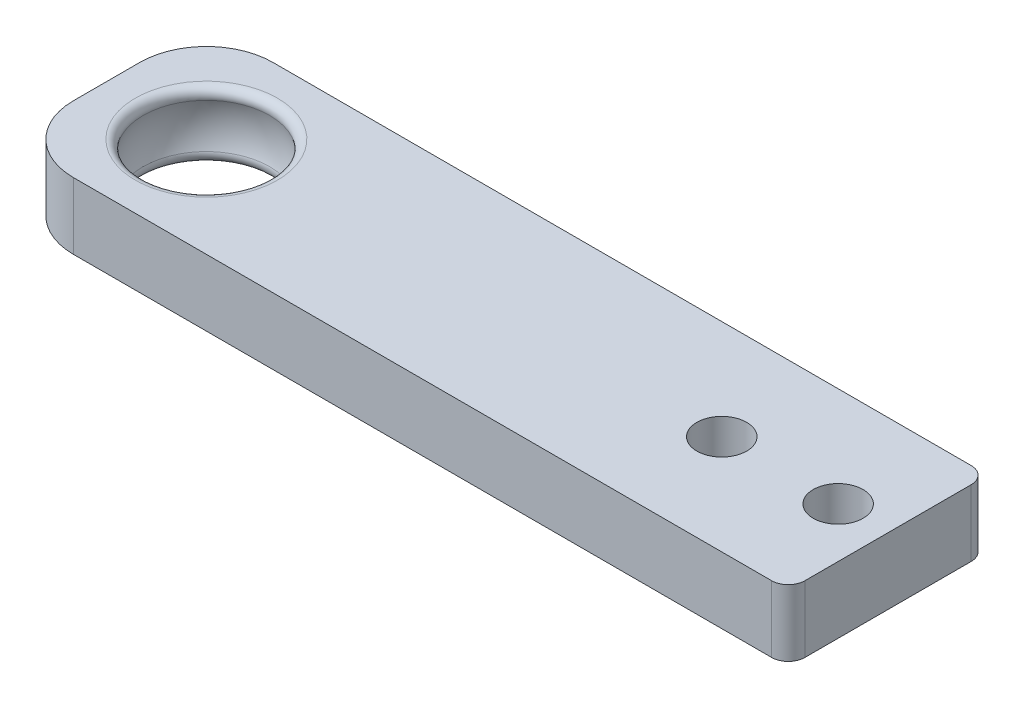
ISO-10303-21;
HEADER;
FILE_DESCRIPTION(('STEP AP214'),'2;1');
FILE_NAME('part.step','',(''),(''),'','','');
FILE_SCHEMA(('AUTOMOTIVE_DESIGN { 1 0 10303 214 1 1 1 1 }'));
ENDSEC;
DATA;
#1=APPLICATION_CONTEXT('core data for automotive mechanical design processes');
#2=APPLICATION_PROTOCOL_DEFINITION('international standard','automotive_design',2000,#1);
#3=PRODUCT_CONTEXT('',#1,'mechanical');
#4=PRODUCT('Part','Part','',(#3));
#5=PRODUCT_RELATED_PRODUCT_CATEGORY('part','',(#4));
#6=PRODUCT_DEFINITION_FORMATION('','',#4);
#7=PRODUCT_DEFINITION_CONTEXT('part definition',#1,'design');
#8=PRODUCT_DEFINITION('design','',#6,#7);
#9=PRODUCT_DEFINITION_SHAPE('','',#8);
#10=(LENGTH_UNIT() NAMED_UNIT(*) SI_UNIT(.MILLI.,.METRE.));
#11=(NAMED_UNIT(*) PLANE_ANGLE_UNIT() SI_UNIT($,.RADIAN.));
#12=(NAMED_UNIT(*) SI_UNIT($,.STERADIAN.) SOLID_ANGLE_UNIT());
#13=UNCERTAINTY_MEASURE_WITH_UNIT(LENGTH_MEASURE(1.E-05),#10,'distance_accuracy_value','');
#14=(GEOMETRIC_REPRESENTATION_CONTEXT(3) GLOBAL_UNCERTAINTY_ASSIGNED_CONTEXT((#13)) GLOBAL_UNIT_ASSIGNED_CONTEXT((#10,
#11,#12)) REPRESENTATION_CONTEXT('',''));
#15=CARTESIAN_POINT('',(0.,0.,0.));
#16=DIRECTION('',(0.,0.,1.));
#17=DIRECTION('',(1.,0.,0.));
#18=AXIS2_PLACEMENT_3D('',#15,#16,#17);
#19=CARTESIAN_POINT('',(-16.,4.,-6.));
#20=DIRECTION('',(1.,0.,0.));
#21=DIRECTION('',(0.,0.,-1.));
#22=AXIS2_PLACEMENT_3D('',#19,#20,#21);
#23=PLANE('',#22);
#24=DIRECTION('',(0.,0.,1.));
#25=VECTOR('',#24,1.);
#26=CARTESIAN_POINT('',(-16.,4.,-6.));
#27=LINE('',#26,#25);
#28=CARTESIAN_POINT('',(-16.,4.,-2.));
#29=VERTEX_POINT('',#28);
#30=CARTESIAN_POINT('',(-16.,4.,2.));
#31=VERTEX_POINT('',#30);
#32=EDGE_CURVE('E127',#29,#31,#27,.T.);
#33=ORIENTED_EDGE('',*,*,#32,.F.);
#34=DIRECTION('',(0.,-1.,0.));
#35=VECTOR('',#34,1.);
#36=CARTESIAN_POINT('',(-16.,4.,-2.));
#37=LINE('',#36,#35);
#38=CARTESIAN_POINT('',(-16.,0.,-2.));
#39=VERTEX_POINT('',#38);
#40=EDGE_CURVE('E115',#29,#39,#37,.T.);
#41=ORIENTED_EDGE('',*,*,#40,.T.);
#42=DIRECTION('',(0.,0.,1.));
#43=VECTOR('',#42,1.);
#44=CARTESIAN_POINT('',(-16.,0.,-6.));
#45=LINE('',#44,#43);
#46=CARTESIAN_POINT('',(-16.,0.,2.));
#47=VERTEX_POINT('',#46);
#48=EDGE_CURVE('E124',#39,#47,#45,.T.);
#49=ORIENTED_EDGE('',*,*,#48,.T.);
#50=DIRECTION('',(0.,-1.,0.));
#51=VECTOR('',#50,1.);
#52=CARTESIAN_POINT('',(-16.,4.,2.));
#53=LINE('',#52,#51);
#54=EDGE_CURVE('E130',#47,#31,#53,.F.);
#55=ORIENTED_EDGE('',*,*,#54,.T.);
#56=EDGE_LOOP('',(#33,#41,#49,#55));
#57=FACE_BOUND('',#56,.T.);
#58=ADVANCED_FACE('F41',(#57),#23,.F.);
#59=CARTESIAN_POINT('',(16.,4.,6.));
#60=DIRECTION('',(0.,0.,-1.));
#61=DIRECTION('',(-1.,0.,0.));
#62=AXIS2_PLACEMENT_3D('',#59,#60,#61);
#63=PLANE('',#62);
#64=DIRECTION('',(1.,0.,0.));
#65=VECTOR('',#64,1.);
#66=CARTESIAN_POINT('',(16.,0.,6.));
#67=LINE('',#66,#65);
#68=CARTESIAN_POINT('',(-12.,0.,6.));
#69=VERTEX_POINT('',#68);
#70=CARTESIAN_POINT('',(30.,0.,5.99999999999999));
#71=VERTEX_POINT('',#70);
#72=EDGE_CURVE('E132',#69,#71,#67,.T.);
#73=ORIENTED_EDGE('',*,*,#72,.T.);
#74=DIRECTION('',(0.,-1.,0.));
#75=VECTOR('',#74,1.);
#76=CARTESIAN_POINT('',(30.,4.,5.99999999999999));
#77=LINE('',#76,#75);
#78=CARTESIAN_POINT('',(30.,4.,5.99999999999999));
#79=VERTEX_POINT('',#78);
#80=EDGE_CURVE('E61',#71,#79,#77,.F.);
#81=ORIENTED_EDGE('',*,*,#80,.T.);
#82=DIRECTION('',(1.,0.,0.));
#83=VECTOR('',#82,1.);
#84=CARTESIAN_POINT('',(16.,4.,6.));
#85=LINE('',#84,#83);
#86=CARTESIAN_POINT('',(-12.,4.,6.));
#87=VERTEX_POINT('',#86);
#88=EDGE_CURVE('E179',#87,#79,#85,.T.);
#89=ORIENTED_EDGE('',*,*,#88,.F.);
#90=DIRECTION('',(0.,-1.,0.));
#91=VECTOR('',#90,1.);
#92=CARTESIAN_POINT('',(-12.,4.,6.));
#93=LINE('',#92,#91);
#94=EDGE_CURVE('E152',#87,#69,#93,.T.);
#95=ORIENTED_EDGE('',*,*,#94,.T.);
#96=EDGE_LOOP('',(#73,#81,#89,#95));
#97=FACE_BOUND('',#96,.T.);
#98=ADVANCED_FACE('F189',(#97),#63,.F.);
#99=CARTESIAN_POINT('',(16.,4.,-6.));
#100=DIRECTION('',(0.,0.,1.));
#101=DIRECTION('',(1.,0.,0.));
#102=AXIS2_PLACEMENT_3D('',#99,#100,#101);
#103=PLANE('',#102);
#104=DIRECTION('',(-1.,0.,0.));
#105=VECTOR('',#104,1.);
#106=CARTESIAN_POINT('',(16.,4.,-6.));
#107=LINE('',#106,#105);
#108=CARTESIAN_POINT('',(30.,4.,-6.));
#109=VERTEX_POINT('',#108);
#110=CARTESIAN_POINT('',(-12.,4.,-6.));
#111=VERTEX_POINT('',#110);
#112=EDGE_CURVE('E142',#109,#111,#107,.T.);
#113=ORIENTED_EDGE('',*,*,#112,.F.);
#114=DIRECTION('',(0.,1.,0.));
#115=VECTOR('',#114,1.);
#116=CARTESIAN_POINT('',(30.,0.,-6.));
#117=LINE('',#116,#115);
#118=CARTESIAN_POINT('',(30.,0.,-6.));
#119=VERTEX_POINT('',#118);
#120=EDGE_CURVE('E11',#109,#119,#117,.F.);
#121=ORIENTED_EDGE('',*,*,#120,.T.);
#122=DIRECTION('',(-1.,0.,0.));
#123=VECTOR('',#122,1.);
#124=CARTESIAN_POINT('',(16.,0.,-6.));
#125=LINE('',#124,#123);
#126=CARTESIAN_POINT('',(-12.,0.,-6.));
#127=VERTEX_POINT('',#126);
#128=EDGE_CURVE('E135',#119,#127,#125,.T.);
#129=ORIENTED_EDGE('',*,*,#128,.T.);
#130=DIRECTION('',(0.,-1.,0.));
#131=VECTOR('',#130,1.);
#132=CARTESIAN_POINT('',(-12.,4.,-6.));
#133=LINE('',#132,#131);
#134=EDGE_CURVE('E112',#127,#111,#133,.F.);
#135=ORIENTED_EDGE('',*,*,#134,.T.);
#136=EDGE_LOOP('',(#113,#121,#129,#135));
#137=FACE_BOUND('',#136,.T.);
#138=ADVANCED_FACE('F220',(#137),#103,.F.);
#139=CARTESIAN_POINT('',(0.,4.,0.));
#140=DIRECTION('',(0.,-1.,0.));
#141=DIRECTION('',(0.,0.,-1.));
#142=AXIS2_PLACEMENT_3D('',#139,#140,#141);
#143=PLANE('',#142);
#144=CARTESIAN_POINT('',(21.,4.,0.));
#145=DIRECTION('',(0.,1.,0.));
#146=DIRECTION('',(0.,0.,1.));
#147=AXIS2_PLACEMENT_3D('',#144,#145,#146);
#148=CIRCLE('',#147,1.5);
#149=CARTESIAN_POINT('',(21.,4.,1.5));
#150=VERTEX_POINT('',#149);
#151=EDGE_CURVE('E205',#150,#150,#148,.T.);
#152=ORIENTED_EDGE('',*,*,#151,.F.);
#153=EDGE_LOOP('',(#152));
#154=FACE_BOUND('',#153,.T.);
#155=CARTESIAN_POINT('',(28.,4.,0.));
#156=DIRECTION('',(0.,1.,0.));
#157=DIRECTION('',(0.,0.,1.));
#158=AXIS2_PLACEMENT_3D('',#155,#156,#157);
#159=CIRCLE('',#158,1.5);
#160=CARTESIAN_POINT('',(28.,4.,1.5));
#161=VERTEX_POINT('',#160);
#162=EDGE_CURVE('E200',#161,#161,#159,.T.);
#163=ORIENTED_EDGE('',*,*,#162,.F.);
#164=EDGE_LOOP('',(#163));
#165=FACE_BOUND('',#164,.T.);
#166=CARTESIAN_POINT('',(-10.,4.,0.));
#167=DIRECTION('',(0.,-1.,0.));
#168=DIRECTION('',(0.,0.,-1.));
#169=AXIS2_PLACEMENT_3D('',#166,#167,#168);
#170=CIRCLE('',#169,4.27564367951181);
#171=CARTESIAN_POINT('',(-10.,4.,-4.27564367951181));
#172=VERTEX_POINT('',#171);
#173=EDGE_CURVE('E163',#172,#172,#170,.T.);
#174=ORIENTED_EDGE('',*,*,#173,.T.);
#175=EDGE_LOOP('',(#174));
#176=FACE_BOUND('',#175,.T.);
#177=ORIENTED_EDGE('',*,*,#88,.T.);
#178=CARTESIAN_POINT('',(30.,4.,4.99999999999999));
#179=DIRECTION('',(0.,-1.,0.));
#180=DIRECTION('',(0.,0.,-1.));
#181=AXIS2_PLACEMENT_3D('',#178,#179,#180);
#182=CIRCLE('',#181,1.);
#183=CARTESIAN_POINT('',(31.,4.,4.99999999999999));
#184=VERTEX_POINT('',#183);
#185=EDGE_CURVE('E47',#79,#184,#182,.F.);
#186=ORIENTED_EDGE('',*,*,#185,.T.);
#187=DIRECTION('',(0.,0.,1.));
#188=VECTOR('',#187,1.);
#189=CARTESIAN_POINT('',(31.,4.,6.));
#190=LINE('',#189,#188);
#191=CARTESIAN_POINT('',(31.,4.,-5.));
#192=VERTEX_POINT('',#191);
#193=EDGE_CURVE('E134',#192,#184,#190,.T.);
#194=ORIENTED_EDGE('',*,*,#193,.F.);
#195=CARTESIAN_POINT('',(30.,4.,-5.));
#196=DIRECTION('',(0.,-1.,0.));
#197=DIRECTION('',(0.,0.,-1.));
#198=AXIS2_PLACEMENT_3D('',#195,#196,#197);
#199=CIRCLE('',#198,1.);
#200=EDGE_CURVE('E57',#192,#109,#199,.F.);
#201=ORIENTED_EDGE('',*,*,#200,.T.);
#202=ORIENTED_EDGE('',*,*,#112,.T.);
#203=CARTESIAN_POINT('',(-12.,4.,-2.));
#204=DIRECTION('',(0.,-1.,0.));
#205=DIRECTION('',(0.,0.,-1.));
#206=AXIS2_PLACEMENT_3D('',#203,#204,#205);
#207=CIRCLE('',#206,4.);
#208=EDGE_CURVE('E148',#111,#29,#207,.F.);
#209=ORIENTED_EDGE('',*,*,#208,.T.);
#210=ORIENTED_EDGE('',*,*,#32,.T.);
#211=CARTESIAN_POINT('',(-12.,4.,2.));
#212=DIRECTION('',(0.,-1.,0.));
#213=DIRECTION('',(0.,0.,-1.));
#214=AXIS2_PLACEMENT_3D('',#211,#212,#213);
#215=CIRCLE('',#214,4.);
#216=EDGE_CURVE('E149',#31,#87,#215,.F.);
#217=ORIENTED_EDGE('',*,*,#216,.T.);
#218=EDGE_LOOP('',(#177,#186,#194,#201,#202,#209,#210,#217));
#219=FACE_BOUND('',#218,.T.);
#220=ADVANCED_FACE('F177',(#154,#165,#176,#219),#143,.F.);
#221=CARTESIAN_POINT('',(0.,0.,0.));
#222=DIRECTION('',(0.,-1.,0.));
#223=DIRECTION('',(0.,0.,-1.));
#224=AXIS2_PLACEMENT_3D('',#221,#222,#223);
#225=PLANE('',#224);
#226=CARTESIAN_POINT('',(21.,0.,0.));
#227=DIRECTION('',(0.,1.,0.));
#228=DIRECTION('',(0.,0.,1.));
#229=AXIS2_PLACEMENT_3D('',#226,#227,#228);
#230=CIRCLE('',#229,1.5);
#231=CARTESIAN_POINT('',(21.,0.,1.5));
#232=VERTEX_POINT('',#231);
#233=EDGE_CURVE('E196',#232,#232,#230,.T.);
#234=ORIENTED_EDGE('',*,*,#233,.T.);
#235=EDGE_LOOP('',(#234));
#236=FACE_BOUND('',#235,.T.);
#237=CARTESIAN_POINT('',(28.,0.,0.));
#238=DIRECTION('',(0.,1.,0.));
#239=DIRECTION('',(0.,0.,1.));
#240=AXIS2_PLACEMENT_3D('',#237,#238,#239);
#241=CIRCLE('',#240,1.5);
#242=CARTESIAN_POINT('',(28.,0.,1.5));
#243=VERTEX_POINT('',#242);
#244=EDGE_CURVE('E197',#243,#243,#241,.T.);
#245=ORIENTED_EDGE('',*,*,#244,.T.);
#246=EDGE_LOOP('',(#245));
#247=FACE_BOUND('',#246,.T.);
#248=CARTESIAN_POINT('',(-10.,0.,0.));
#249=DIRECTION('',(0.,-1.,0.));
#250=DIRECTION('',(0.,0.,-1.));
#251=AXIS2_PLACEMENT_3D('',#248,#249,#250);
#252=CIRCLE('',#251,4.27564367951181);
#253=CARTESIAN_POINT('',(-10.,0.,-4.27564367951181));
#254=VERTEX_POINT('',#253);
#255=EDGE_CURVE('E165',#254,#254,#252,.F.);
#256=ORIENTED_EDGE('',*,*,#255,.T.);
#257=EDGE_LOOP('',(#256));
#258=FACE_BOUND('',#257,.T.);
#259=DIRECTION('',(0.,0.,-1.));
#260=VECTOR('',#259,1.);
#261=CARTESIAN_POINT('',(31.,0.,6.));
#262=LINE('',#261,#260);
#263=CARTESIAN_POINT('',(31.,0.,4.99999999999999));
#264=VERTEX_POINT('',#263);
#265=CARTESIAN_POINT('',(31.,0.,-5.));
#266=VERTEX_POINT('',#265);
#267=EDGE_CURVE('E140',#264,#266,#262,.T.);
#268=ORIENTED_EDGE('',*,*,#267,.F.);
#269=CARTESIAN_POINT('',(30.,0.,4.99999999999999));
#270=DIRECTION('',(0.,-1.,0.));
#271=DIRECTION('',(0.,0.,-1.));
#272=AXIS2_PLACEMENT_3D('',#269,#270,#271);
#273=CIRCLE('',#272,1.);
#274=EDGE_CURVE('E174',#264,#71,#273,.T.);
#275=ORIENTED_EDGE('',*,*,#274,.T.);
#276=ORIENTED_EDGE('',*,*,#72,.F.);
#277=CARTESIAN_POINT('',(-12.,0.,2.));
#278=DIRECTION('',(0.,-1.,0.));
#279=DIRECTION('',(0.,0.,-1.));
#280=AXIS2_PLACEMENT_3D('',#277,#278,#279);
#281=CIRCLE('',#280,4.);
#282=EDGE_CURVE('E117',#69,#47,#281,.T.);
#283=ORIENTED_EDGE('',*,*,#282,.T.);
#284=ORIENTED_EDGE('',*,*,#48,.F.);
#285=CARTESIAN_POINT('',(-12.,0.,-2.));
#286=DIRECTION('',(0.,-1.,0.));
#287=DIRECTION('',(0.,0.,-1.));
#288=AXIS2_PLACEMENT_3D('',#285,#286,#287);
#289=CIRCLE('',#288,4.);
#290=EDGE_CURVE('E108',#39,#127,#289,.T.);
#291=ORIENTED_EDGE('',*,*,#290,.T.);
#292=ORIENTED_EDGE('',*,*,#128,.F.);
#293=CARTESIAN_POINT('',(30.,0.,-5.));
#294=DIRECTION('',(0.,-1.,0.));
#295=DIRECTION('',(0.,0.,-1.));
#296=AXIS2_PLACEMENT_3D('',#293,#294,#295);
#297=CIRCLE('',#296,1.);
#298=EDGE_CURVE('E173',#119,#266,#297,.T.);
#299=ORIENTED_EDGE('',*,*,#298,.T.);
#300=EDGE_LOOP('',(#268,#275,#276,#283,#284,#291,#292,#299));
#301=FACE_BOUND('',#300,.T.);
#302=ADVANCED_FACE('F128',(#236,#247,#258,#301),#225,.T.);
#303=CARTESIAN_POINT('',(-10.,2.,0.));
#304=DIRECTION('',(0.,1.,0.));
#305=DIRECTION('',(-1.,0.,0.));
#306=AXIS2_PLACEMENT_3D('',#303,#304,#305);
#307=SPHERICAL_SURFACE('',#306,4.03112887414928);
#308=CARTESIAN_POINT('',(-10.,3.33447833402425,0.));
#309=DIRECTION('',(0.,-1.,0.));
#310=DIRECTION('',(0.,0.,-1.));
#311=AXIS2_PLACEMENT_3D('',#308,#309,#310);
#312=CIRCLE('',#311,3.8038359028775);
#313=CARTESIAN_POINT('',(-13.8038359028775,3.33447833402425,0.));
#314=VERTEX_POINT('',#313);
#315=EDGE_CURVE('E160',#314,#314,#312,.F.);
#316=CARTESIAN_POINT('',(-10.,0.665521665975747,0.));
#317=DIRECTION('',(0.,1.,0.));
#318=DIRECTION('',(0.,0.,1.));
#319=AXIS2_PLACEMENT_3D('',#316,#317,#318);
#320=CIRCLE('',#319,3.8038359028775);
#321=CARTESIAN_POINT('',(-13.8038359028775,0.665521665975747,0.));
#322=VERTEX_POINT('',#321);
#323=EDGE_CURVE('E155',#322,#322,#320,.F.);
#324=CARTESIAN_POINT('',(-13.8038359028775,3.33447833402425,0.));
#325=CARTESIAN_POINT('',(-13.813216470049,3.30773983630377,0.));
#326=CARTESIAN_POINT('',(-13.8223150164849,3.28090240068326,0.));
#327=CARTESIAN_POINT('',(-13.8399442210205,3.22704165317102,0.));
#328=CARTESIAN_POINT('',(-13.8484748791202,3.20001834127931,0.));
#329=CARTESIAN_POINT('',(-13.8649644601183,3.14579784075353,0.));
#330=CARTESIAN_POINT('',(-13.8729233830168,3.11860065211948,0.));
#331=CARTESIAN_POINT('',(-13.8882659686585,3.06404449710711,0.));
#332=CARTESIAN_POINT('',(-13.8956496314019,3.0366855307288,0.));
#333=CARTESIAN_POINT('',(-13.909838409461,2.9818179852324,0.));
#334=CARTESIAN_POINT('',(-13.9166435247767,2.95430940611432,0.));
#335=CARTESIAN_POINT('',(-13.9296721828406,2.89915486826431,0.));
#336=CARTESIAN_POINT('',(-13.9358957255887,2.87150890953239,0.));
#337=CARTESIAN_POINT('',(-13.9477584706951,2.81609190624591,0.));
#338=CARTESIAN_POINT('',(-13.9533976730534,2.78832086169135,0.));
#339=CARTESIAN_POINT('',(-13.9640892297568,2.73266603628935,0.));
#340=CARTESIAN_POINT('',(-13.969141584102,2.70478225544191,0.));
#341=CARTESIAN_POINT('',(-13.9786571980282,2.64891435708606,0.));
#342=CARTESIAN_POINT('',(-13.9831204576092,2.62093023957763,0.));
#343=CARTESIAN_POINT('',(-13.9914558972453,2.56487411215859,0.));
#344=CARTESIAN_POINT('',(-13.9953280773004,2.53680210224797,0.));
#345=CARTESIAN_POINT('',(-14.0024796359638,2.480582673366,0.));
#346=CARTESIAN_POINT('',(-14.005759014572,2.45243525439465,0.));
#347=CARTESIAN_POINT('',(-14.011723512035,2.39607752426692,0.));
#348=CARTESIAN_POINT('',(-14.0144086308897,2.36786721311054,0.));
#349=CARTESIAN_POINT('',(-14.0191834148003,2.31139624345584,0.));
#350=CARTESIAN_POINT('',(-14.021273079856,2.28313558495752,0.));
#351=CARTESIAN_POINT('',(-14.0248560269154,2.226576487851,0.));
#352=CARTESIAN_POINT('',(-14.026349308919,2.1982780492428,0.));
#353=CARTESIAN_POINT('',(-14.0287388258265,2.14165597594905,0.));
#354=CARTESIAN_POINT('',(-14.0296350607304,2.11333234126349,0.));
#355=CARTESIAN_POINT('',(-14.0308300848918,2.05667247105195,0.));
#356=CARTESIAN_POINT('',(-14.0311288741493,2.02833623552598,0.));
#357=CARTESIAN_POINT('',(-14.0311288741493,1.97166376447402,0.));
#358=CARTESIAN_POINT('',(-14.0308300848918,1.94332752894805,0.));
#359=CARTESIAN_POINT('',(-14.0296350607304,1.88666765873651,0.));
#360=CARTESIAN_POINT('',(-14.0287388258265,1.85834402405095,0.));
#361=CARTESIAN_POINT('',(-14.026349308919,1.8017219507572,0.));
#362=CARTESIAN_POINT('',(-14.0248560269154,1.773423512149,0.));
#363=CARTESIAN_POINT('',(-14.021273079856,1.71686441504248,0.));
#364=CARTESIAN_POINT('',(-14.0191834148003,1.68860375654416,0.));
#365=CARTESIAN_POINT('',(-14.0144086308897,1.63213278688946,0.));
#366=CARTESIAN_POINT('',(-14.011723512035,1.60392247573308,0.));
#367=CARTESIAN_POINT('',(-14.005759014572,1.54756474560535,0.));
#368=CARTESIAN_POINT('',(-14.0024796359638,1.519417326634,0.));
#369=CARTESIAN_POINT('',(-13.9953280773004,1.46319789775203,0.));
#370=CARTESIAN_POINT('',(-13.9914558972453,1.43512588784141,0.));
#371=CARTESIAN_POINT('',(-13.9831204576092,1.37906976042237,0.));
#372=CARTESIAN_POINT('',(-13.9786571980282,1.35108564291394,0.));
#373=CARTESIAN_POINT('',(-13.969141584102,1.29521774455809,0.));
#374=CARTESIAN_POINT('',(-13.9640892297568,1.26733396371065,0.));
#375=CARTESIAN_POINT('',(-13.9533976730534,1.21167913830865,0.));
#376=CARTESIAN_POINT('',(-13.9477584706951,1.18390809375409,0.));
#377=CARTESIAN_POINT('',(-13.9358957255887,1.12849109046761,0.));
#378=CARTESIAN_POINT('',(-13.9296721828406,1.10084513173569,0.));
#379=CARTESIAN_POINT('',(-13.9166435247767,1.04569059388568,0.));
#380=CARTESIAN_POINT('',(-13.909838409461,1.0181820147676,0.));
#381=CARTESIAN_POINT('',(-13.8956496314019,0.963314469271204,0.));
#382=CARTESIAN_POINT('',(-13.8882659686585,0.93595550289289,0.));
#383=CARTESIAN_POINT('',(-13.8729233830168,0.881399347880521,0.));
#384=CARTESIAN_POINT('',(-13.8649644601183,0.854202159246467,0.));
#385=CARTESIAN_POINT('',(-13.8484748791202,0.799981658720695,0.));
#386=CARTESIAN_POINT('',(-13.8399442210205,0.772958346828977,0.));
#387=CARTESIAN_POINT('',(-13.8223150164849,0.719097599316744,0.));
#388=CARTESIAN_POINT('',(-13.813216470049,0.692260163696228,0.));
#389=CARTESIAN_POINT('',(-13.8038359028775,0.665521665975747,0.));
#390=B_SPLINE_CURVE_WITH_KNOTS('',3,(#324,#325,#326,#327,#328,#329,#330,#331,#332,#333,#334,
#335,#336,#337,#338,#339,#340,#341,#342,#343,#344,#345,#346,#347,#348,#349,#350,#351,#352,#353,
#354,#355,#356,#357,#358,#359,#360,#361,#362,#363,#364,#365,#366,#367,#368,#369,#370,#371,#372,
#373,#374,#375,#376,#377,#378,#379,#380,#381,#382,#383,#384,#385,#386,#387,#388,#389),
.UNSPECIFIED.,.F.,.F.,(4,2,2,2,2,2,2,2,2,2,2,2,2,2,2,2,2,2,2,2,2,2,2,2,2,2,2,2,2,2,2,2,4),(0.,
0.085007131516663,0.170014263033326,0.255021394549989,0.340028526066652,0.425035657583315,
0.510042789099978,0.595049920616641,0.680057052133304,0.765064183649967,0.85007131516663,
0.935078446683293,1.02008557819996,1.10509270971662,1.19009984123328,1.27510697274994,
1.36011410426661,1.44512123578327,1.53012836729993,1.6151354988166,1.70014263033326,
1.78514976184992,1.87015689336659,1.95516402488325,2.04017115639991,2.12517828791657,
2.21018541943324,2.2951925509499,2.38019968246656,2.46520681398323,2.55021394549989,
2.63522107701655,2.72022820853321),.UNSPECIFIED.);
#391=EDGE_CURVE('BSEAM231',#314,#322,#390,.T.);
#392=ORIENTED_EDGE('',*,*,#315,.T.);
#393=ORIENTED_EDGE('',*,*,#323,.T.);
#394=ORIENTED_EDGE('',*,*,#391,.T.);
#395=ORIENTED_EDGE('',*,*,#391,.F.);
#396=EDGE_LOOP('',(#392,#394,#393,#395));
#397=FACE_BOUND('',#396,.T.);
#398=ADVANCED_FACE('F231',(#397),#307,.F.);
#399=CARTESIAN_POINT('',(-12.,4.,-2.));
#400=DIRECTION('',(0.,-1.,0.));
#401=DIRECTION('',(0.,0.,-1.));
#402=AXIS2_PLACEMENT_3D('',#399,#400,#401);
#403=CYLINDRICAL_SURFACE('',#402,4.);
#404=ORIENTED_EDGE('',*,*,#208,.F.);
#405=ORIENTED_EDGE('',*,*,#134,.F.);
#406=ORIENTED_EDGE('',*,*,#290,.F.);
#407=ORIENTED_EDGE('',*,*,#40,.F.);
#408=EDGE_LOOP('',(#404,#405,#406,#407));
#409=FACE_BOUND('',#408,.T.);
#410=ADVANCED_FACE('F111',(#409),#403,.T.);
#411=CARTESIAN_POINT('',(-12.,4.,2.));
#412=DIRECTION('',(0.,-1.,0.));
#413=DIRECTION('',(0.,0.,-1.));
#414=AXIS2_PLACEMENT_3D('',#411,#412,#413);
#415=CYLINDRICAL_SURFACE('',#414,4.);
#416=ORIENTED_EDGE('',*,*,#216,.F.);
#417=ORIENTED_EDGE('',*,*,#54,.F.);
#418=ORIENTED_EDGE('',*,*,#282,.F.);
#419=ORIENTED_EDGE('',*,*,#94,.F.);
#420=EDGE_LOOP('',(#416,#417,#418,#419));
#421=FACE_BOUND('',#420,.T.);
#422=ADVANCED_FACE('F195',(#421),#415,.T.);
#423=CARTESIAN_POINT('',(-10.,3.5,0.));
#424=DIRECTION('',(0.,-1.,0.));
#425=DIRECTION('',(0.,0.,-1.));
#426=AXIS2_PLACEMENT_3D('',#423,#424,#425);
#427=TOROIDAL_SURFACE('',#426,4.27564367951181,0.5);
#428=ORIENTED_EDGE('',*,*,#173,.F.);
#429=EDGE_LOOP('',(#428));
#430=FACE_BOUND('',#429,.T.);
#431=ORIENTED_EDGE('',*,*,#315,.F.);
#432=EDGE_LOOP('',(#431));
#433=FACE_BOUND('',#432,.T.);
#434=ADVANCED_FACE('F228',(#430,#433),#427,.T.);
#435=CARTESIAN_POINT('',(-10.,0.5,0.));
#436=DIRECTION('',(0.,-1.,0.));
#437=DIRECTION('',(0.,0.,-1.));
#438=AXIS2_PLACEMENT_3D('',#435,#436,#437);
#439=TOROIDAL_SURFACE('',#438,4.27564367951181,0.5);
#440=ORIENTED_EDGE('',*,*,#323,.F.);
#441=EDGE_LOOP('',(#440));
#442=FACE_BOUND('',#441,.T.);
#443=ORIENTED_EDGE('',*,*,#255,.F.);
#444=EDGE_LOOP('',(#443));
#445=FACE_BOUND('',#444,.T.);
#446=ADVANCED_FACE('F230',(#442,#445),#439,.T.);
#447=CARTESIAN_POINT('',(31.,0.,0.));
#448=DIRECTION('',(1.,0.,0.));
#449=DIRECTION('',(0.,0.,-1.));
#450=AXIS2_PLACEMENT_3D('',#447,#448,#449);
#451=PLANE('',#450);
#452=ORIENTED_EDGE('',*,*,#193,.T.);
#453=DIRECTION('',(0.,-1.,0.));
#454=VECTOR('',#453,1.);
#455=CARTESIAN_POINT('',(31.,0.,4.99999999999999));
#456=LINE('',#455,#454);
#457=EDGE_CURVE('E167',#184,#264,#456,.T.);
#458=ORIENTED_EDGE('',*,*,#457,.T.);
#459=ORIENTED_EDGE('',*,*,#267,.T.);
#460=DIRECTION('',(0.,1.,0.));
#461=VECTOR('',#460,1.);
#462=CARTESIAN_POINT('',(31.,4.,-5.));
#463=LINE('',#462,#461);
#464=EDGE_CURVE('E170',#266,#192,#463,.T.);
#465=ORIENTED_EDGE('',*,*,#464,.T.);
#466=EDGE_LOOP('',(#452,#458,#459,#465));
#467=FACE_BOUND('',#466,.T.);
#468=ADVANCED_FACE('F183',(#467),#451,.T.);
#469=CARTESIAN_POINT('',(28.,0.,0.));
#470=DIRECTION('',(0.,1.,0.));
#471=DIRECTION('',(0.,0.,1.));
#472=AXIS2_PLACEMENT_3D('',#469,#470,#471);
#473=CYLINDRICAL_SURFACE('',#472,1.5);
#474=ORIENTED_EDGE('',*,*,#244,.F.);
#475=EDGE_LOOP('',(#474));
#476=FACE_BOUND('',#475,.T.);
#477=ORIENTED_EDGE('',*,*,#162,.T.);
#478=EDGE_LOOP('',(#477));
#479=FACE_BOUND('',#478,.T.);
#480=ADVANCED_FACE('F211',(#476,#479),#473,.F.);
#481=CARTESIAN_POINT('',(21.,0.,0.));
#482=DIRECTION('',(0.,1.,0.));
#483=DIRECTION('',(0.,0.,1.));
#484=AXIS2_PLACEMENT_3D('',#481,#482,#483);
#485=CYLINDRICAL_SURFACE('',#484,1.5);
#486=ORIENTED_EDGE('',*,*,#233,.F.);
#487=EDGE_LOOP('',(#486));
#488=FACE_BOUND('',#487,.T.);
#489=ORIENTED_EDGE('',*,*,#151,.T.);
#490=EDGE_LOOP('',(#489));
#491=FACE_BOUND('',#490,.T.);
#492=ADVANCED_FACE('F212',(#488,#491),#485,.F.);
#493=CARTESIAN_POINT('',(30.,0.,4.99999999999999));
#494=DIRECTION('',(0.,1.,0.));
#495=DIRECTION('',(0.,0.,1.));
#496=AXIS2_PLACEMENT_3D('',#493,#494,#495);
#497=CYLINDRICAL_SURFACE('',#496,1.);
#498=ORIENTED_EDGE('',*,*,#185,.F.);
#499=ORIENTED_EDGE('',*,*,#80,.F.);
#500=ORIENTED_EDGE('',*,*,#274,.F.);
#501=ORIENTED_EDGE('',*,*,#457,.F.);
#502=EDGE_LOOP('',(#498,#499,#500,#501));
#503=FACE_BOUND('',#502,.T.);
#504=ADVANCED_FACE('F190',(#503),#497,.T.);
#505=CARTESIAN_POINT('',(30.,0.,-5.));
#506=DIRECTION('',(0.,-1.,0.));
#507=DIRECTION('',(0.,0.,-1.));
#508=AXIS2_PLACEMENT_3D('',#505,#506,#507);
#509=CYLINDRICAL_SURFACE('',#508,1.);
#510=ORIENTED_EDGE('',*,*,#298,.F.);
#511=ORIENTED_EDGE('',*,*,#120,.F.);
#512=ORIENTED_EDGE('',*,*,#200,.F.);
#513=ORIENTED_EDGE('',*,*,#464,.F.);
#514=EDGE_LOOP('',(#510,#511,#512,#513));
#515=FACE_BOUND('',#514,.T.);
#516=ADVANCED_FACE('F43',(#515),#509,.T.);
#517=CLOSED_SHELL('',(#58,#98,#138,#220,#302,#398,#410,#422,#434,#446,#468,#480,#492,#504,#516));
#518=MANIFOLD_SOLID_BREP('B2',#517);
#519=ADVANCED_BREP_SHAPE_REPRESENTATION('',(#18,#518),#14);
#520=SHAPE_DEFINITION_REPRESENTATION(#9,#519);
ENDSEC;
END-ISO-10303-21;
